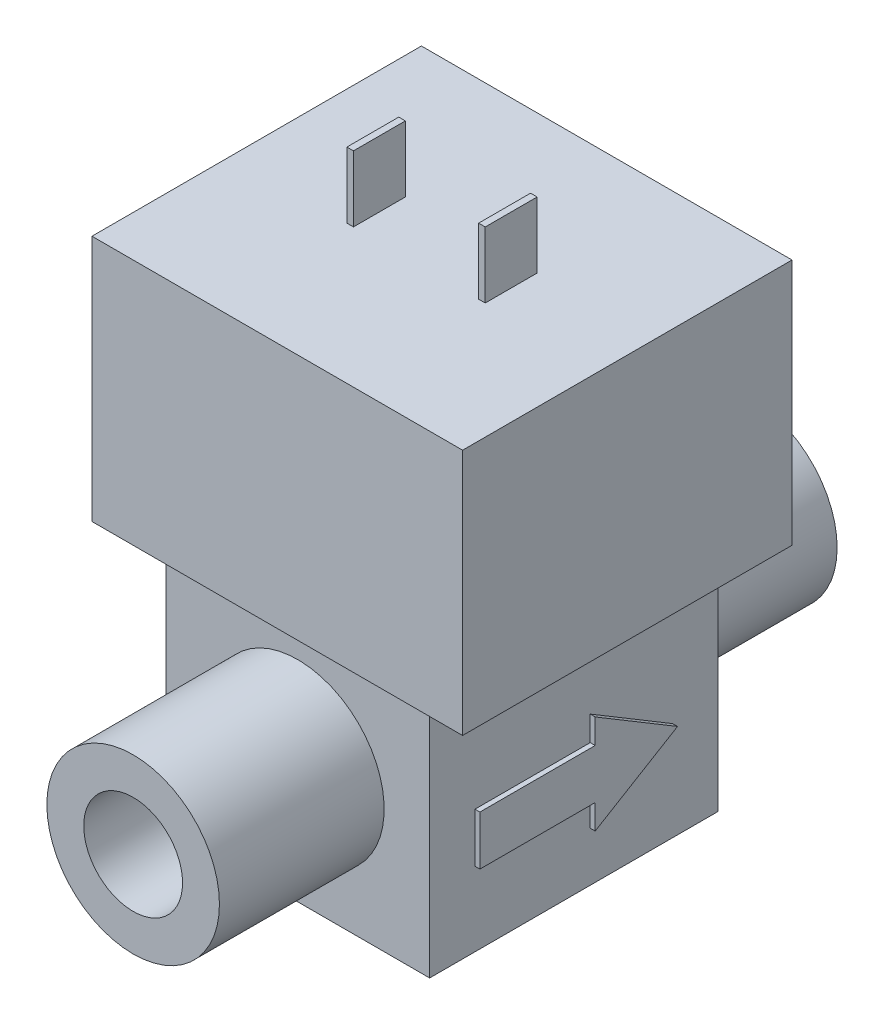
ISO-10303-21;
HEADER;
FILE_DESCRIPTION(('STEP AP214'),'2;1');
FILE_NAME('part.step','',(''),(''),'','','');
FILE_SCHEMA(('AUTOMOTIVE_DESIGN { 1 0 10303 214 1 1 1 1 }'));
ENDSEC;
DATA;
#1=APPLICATION_CONTEXT('core data for automotive mechanical design processes');
#2=APPLICATION_PROTOCOL_DEFINITION('international standard','automotive_design',2000,#1);
#3=PRODUCT_CONTEXT('',#1,'mechanical');
#4=PRODUCT('Part','Part','',(#3));
#5=PRODUCT_RELATED_PRODUCT_CATEGORY('part','',(#4));
#6=PRODUCT_DEFINITION_FORMATION('','',#4);
#7=PRODUCT_DEFINITION_CONTEXT('part definition',#1,'design');
#8=PRODUCT_DEFINITION('design','',#6,#7);
#9=PRODUCT_DEFINITION_SHAPE('','',#8);
#10=(LENGTH_UNIT() NAMED_UNIT(*) SI_UNIT(.MILLI.,.METRE.));
#11=(NAMED_UNIT(*) PLANE_ANGLE_UNIT() SI_UNIT($,.RADIAN.));
#12=(NAMED_UNIT(*) SI_UNIT($,.STERADIAN.) SOLID_ANGLE_UNIT());
#13=UNCERTAINTY_MEASURE_WITH_UNIT(LENGTH_MEASURE(1.E-05),#10,'distance_accuracy_value','');
#14=(GEOMETRIC_REPRESENTATION_CONTEXT(3) GLOBAL_UNCERTAINTY_ASSIGNED_CONTEXT((#13)) GLOBAL_UNIT_ASSIGNED_CONTEXT((#10,
#11,#12)) REPRESENTATION_CONTEXT('',''));
#15=CARTESIAN_POINT('',(0.,0.,0.));
#16=DIRECTION('',(0.,0.,1.));
#17=DIRECTION('',(1.,0.,0.));
#18=AXIS2_PLACEMENT_3D('',#15,#16,#17);
#19=CARTESIAN_POINT('',(16.,30.,17.5));
#20=DIRECTION('',(-1.,0.,0.));
#21=DIRECTION('',(0.,0.,1.));
#22=AXIS2_PLACEMENT_3D('',#19,#20,#21);
#23=PLANE('',#22);
#24=DIRECTION('',(0.,0.,-1.));
#25=VECTOR('',#24,1.);
#26=CARTESIAN_POINT('',(16.,0.,17.5));
#27=LINE('',#26,#25);
#28=CARTESIAN_POINT('',(16.,0.,17.5));
#29=VERTEX_POINT('',#28);
#30=CARTESIAN_POINT('',(16.,0.,-17.5));
#31=VERTEX_POINT('',#30);
#32=EDGE_CURVE('E363',#29,#31,#27,.T.);
#33=ORIENTED_EDGE('',*,*,#32,.T.);
#34=DIRECTION('',(0.,-1.,0.));
#35=VECTOR('',#34,1.);
#36=CARTESIAN_POINT('',(16.,30.,-17.5));
#37=LINE('',#36,#35);
#38=CARTESIAN_POINT('',(16.,30.,-17.5));
#39=VERTEX_POINT('',#38);
#40=EDGE_CURVE('E366',#39,#31,#37,.T.);
#41=ORIENTED_EDGE('',*,*,#40,.F.);
#42=DIRECTION('',(0.,0.,-1.));
#43=VECTOR('',#42,1.);
#44=CARTESIAN_POINT('',(16.,30.,17.5));
#45=LINE('',#44,#43);
#46=CARTESIAN_POINT('',(16.,30.,17.5));
#47=VERTEX_POINT('',#46);
#48=EDGE_CURVE('E349',#47,#39,#45,.T.);
#49=ORIENTED_EDGE('',*,*,#48,.F.);
#50=DIRECTION('',(0.,-1.,0.));
#51=VECTOR('',#50,1.);
#52=CARTESIAN_POINT('',(16.,30.,17.5));
#53=LINE('',#52,#51);
#54=EDGE_CURVE('E367',#47,#29,#53,.T.);
#55=ORIENTED_EDGE('',*,*,#54,.T.);
#56=EDGE_LOOP('',(#33,#41,#49,#55));
#57=FACE_BOUND('',#56,.T.);
#58=DIRECTION('',(0.,-1.,0.));
#59=VECTOR('',#58,1.);
#60=CARTESIAN_POINT('',(16.,15.,12.));
#61=LINE('',#60,#59);
#62=CARTESIAN_POINT('',(16.,15.,12.));
#63=VERTEX_POINT('',#62);
#64=CARTESIAN_POINT('',(16.,9.,12.));
#65=VERTEX_POINT('',#64);
#66=EDGE_CURVE('E225',#63,#65,#61,.T.);
#67=ORIENTED_EDGE('',*,*,#66,.F.);
#68=DIRECTION('',(0.,0.,1.));
#69=VECTOR('',#68,1.);
#70=CARTESIAN_POINT('',(16.,15.,-2.));
#71=LINE('',#70,#69);
#72=CARTESIAN_POINT('',(16.,15.,-2.));
#73=VERTEX_POINT('',#72);
#74=EDGE_CURVE('E217',#73,#63,#71,.T.);
#75=ORIENTED_EDGE('',*,*,#74,.F.);
#76=DIRECTION('',(0.,-1.,0.));
#77=VECTOR('',#76,1.);
#78=CARTESIAN_POINT('',(16.,18.,-2.));
#79=LINE('',#78,#77);
#80=CARTESIAN_POINT('',(16.,18.,-2.));
#81=VERTEX_POINT('',#80);
#82=EDGE_CURVE('E894',#81,#73,#79,.T.);
#83=ORIENTED_EDGE('',*,*,#82,.F.);
#84=DIRECTION('',(0.,0.514495755427527,0.857492925712544));
#85=VECTOR('',#84,1.);
#86=CARTESIAN_POINT('',(16.,12.,-12.));
#87=LINE('',#86,#85);
#88=CARTESIAN_POINT('',(16.,12.,-12.));
#89=VERTEX_POINT('',#88);
#90=EDGE_CURVE('E917',#89,#81,#87,.T.);
#91=ORIENTED_EDGE('',*,*,#90,.F.);
#92=DIRECTION('',(0.,0.514495755427526,-0.857492925712544));
#93=VECTOR('',#92,1.);
#94=CARTESIAN_POINT('',(16.,6.,-2.));
#95=LINE('',#94,#93);
#96=CARTESIAN_POINT('',(16.,5.99999999999999,-2.));
#97=VERTEX_POINT('',#96);
#98=EDGE_CURVE('E911',#97,#89,#95,.T.);
#99=ORIENTED_EDGE('',*,*,#98,.F.);
#100=DIRECTION('',(0.,-1.,0.));
#101=VECTOR('',#100,1.);
#102=CARTESIAN_POINT('',(16.,9.,-2.));
#103=LINE('',#102,#101);
#104=CARTESIAN_POINT('',(16.,9.,-2.));
#105=VERTEX_POINT('',#104);
#106=EDGE_CURVE('E70',#105,#97,#103,.T.);
#107=ORIENTED_EDGE('',*,*,#106,.F.);
#108=DIRECTION('',(0.,0.,-1.));
#109=VECTOR('',#108,1.);
#110=CARTESIAN_POINT('',(16.,9.,12.));
#111=LINE('',#110,#109);
#112=EDGE_CURVE('E65',#65,#105,#111,.T.);
#113=ORIENTED_EDGE('',*,*,#112,.F.);
#114=EDGE_LOOP('',(#67,#75,#83,#91,#99,#107,#113));
#115=FACE_BOUND('',#114,.T.);
#116=ADVANCED_FACE('F50',(#57,#115),#23,.F.);
#117=CARTESIAN_POINT('',(0.,60.,0.));
#118=DIRECTION('',(0.,-1.,0.));
#119=DIRECTION('',(0.,0.,-1.));
#120=AXIS2_PLACEMENT_3D('',#117,#118,#119);
#121=PLANE('',#120);
#122=DIRECTION('',(0.,0.,1.));
#123=VECTOR('',#122,1.);
#124=CARTESIAN_POINT('',(7.6,60.,-3.15));
#125=LINE('',#124,#123);
#126=CARTESIAN_POINT('',(7.6,60.,-3.15));
#127=VERTEX_POINT('',#126);
#128=CARTESIAN_POINT('',(7.6,60.,3.15));
#129=VERTEX_POINT('',#128);
#130=EDGE_CURVE('E250',#127,#129,#125,.T.);
#131=ORIENTED_EDGE('',*,*,#130,.F.);
#132=DIRECTION('',(-1.,0.,0.));
#133=VECTOR('',#132,1.);
#134=CARTESIAN_POINT('',(8.4,60.,-3.15));
#135=LINE('',#134,#133);
#136=CARTESIAN_POINT('',(8.4,60.,-3.15));
#137=VERTEX_POINT('',#136);
#138=EDGE_CURVE('E277',#137,#127,#135,.T.);
#139=ORIENTED_EDGE('',*,*,#138,.F.);
#140=DIRECTION('',(0.,0.,-1.));
#141=VECTOR('',#140,1.);
#142=CARTESIAN_POINT('',(8.4,60.,3.15));
#143=LINE('',#142,#141);
#144=CARTESIAN_POINT('',(8.4,60.,3.15));
#145=VERTEX_POINT('',#144);
#146=EDGE_CURVE('E276',#145,#137,#143,.T.);
#147=ORIENTED_EDGE('',*,*,#146,.F.);
#148=DIRECTION('',(1.,0.,0.));
#149=VECTOR('',#148,1.);
#150=CARTESIAN_POINT('',(7.6,60.,3.15));
#151=LINE('',#150,#149);
#152=EDGE_CURVE('E281',#129,#145,#151,.T.);
#153=ORIENTED_EDGE('',*,*,#152,.F.);
#154=EDGE_LOOP('',(#131,#139,#147,#153));
#155=FACE_BOUND('',#154,.T.);
#156=DIRECTION('',(0.,0.,-1.));
#157=VECTOR('',#156,1.);
#158=CARTESIAN_POINT('',(22.5,60.,20.));
#159=LINE('',#158,#157);
#160=CARTESIAN_POINT('',(22.5,60.,20.));
#161=VERTEX_POINT('',#160);
#162=CARTESIAN_POINT('',(22.5,60.,-20.));
#163=VERTEX_POINT('',#162);
#164=EDGE_CURVE('E312',#161,#163,#159,.T.);
#165=ORIENTED_EDGE('',*,*,#164,.T.);
#166=DIRECTION('',(-1.,0.,0.));
#167=VECTOR('',#166,1.);
#168=CARTESIAN_POINT('',(-22.5,60.,-20.));
#169=LINE('',#168,#167);
#170=CARTESIAN_POINT('',(-22.5,60.,-20.));
#171=VERTEX_POINT('',#170);
#172=EDGE_CURVE('E317',#163,#171,#169,.T.);
#173=ORIENTED_EDGE('',*,*,#172,.T.);
#174=DIRECTION('',(0.,0.,1.));
#175=VECTOR('',#174,1.);
#176=CARTESIAN_POINT('',(-22.5,60.,20.));
#177=LINE('',#176,#175);
#178=CARTESIAN_POINT('',(-22.5,60.,20.));
#179=VERTEX_POINT('',#178);
#180=EDGE_CURVE('E316',#171,#179,#177,.T.);
#181=ORIENTED_EDGE('',*,*,#180,.T.);
#182=DIRECTION('',(1.,0.,0.));
#183=VECTOR('',#182,1.);
#184=CARTESIAN_POINT('',(-22.5,60.,20.));
#185=LINE('',#184,#183);
#186=EDGE_CURVE('E322',#179,#161,#185,.T.);
#187=ORIENTED_EDGE('',*,*,#186,.T.);
#188=EDGE_LOOP('',(#165,#173,#181,#187));
#189=FACE_BOUND('',#188,.T.);
#190=DIRECTION('',(0.,0.,1.));
#191=VECTOR('',#190,1.);
#192=CARTESIAN_POINT('',(-8.4,60.,-3.15));
#193=LINE('',#192,#191);
#194=CARTESIAN_POINT('',(-8.4,60.,-3.15));
#195=VERTEX_POINT('',#194);
#196=CARTESIAN_POINT('',(-8.4,60.,3.15));
#197=VERTEX_POINT('',#196);
#198=EDGE_CURVE('E243',#195,#197,#193,.T.);
#199=ORIENTED_EDGE('',*,*,#198,.F.);
#200=DIRECTION('',(-1.,0.,0.));
#201=VECTOR('',#200,1.);
#202=CARTESIAN_POINT('',(-7.6,60.,-3.15));
#203=LINE('',#202,#201);
#204=CARTESIAN_POINT('',(-7.6,60.,-3.15));
#205=VERTEX_POINT('',#204);
#206=EDGE_CURVE('E236',#205,#195,#203,.T.);
#207=ORIENTED_EDGE('',*,*,#206,.F.);
#208=DIRECTION('',(0.,0.,-1.));
#209=VECTOR('',#208,1.);
#210=CARTESIAN_POINT('',(-7.6,60.,3.15));
#211=LINE('',#210,#209);
#212=CARTESIAN_POINT('',(-7.6,60.,3.15));
#213=VERTEX_POINT('',#212);
#214=EDGE_CURVE('E249',#213,#205,#211,.T.);
#215=ORIENTED_EDGE('',*,*,#214,.F.);
#216=DIRECTION('',(1.,0.,0.));
#217=VECTOR('',#216,1.);
#218=CARTESIAN_POINT('',(-8.4,60.,3.15));
#219=LINE('',#218,#217);
#220=EDGE_CURVE('E246',#197,#213,#219,.T.);
#221=ORIENTED_EDGE('',*,*,#220,.F.);
#222=EDGE_LOOP('',(#199,#207,#215,#221));
#223=FACE_BOUND('',#222,.T.);
#224=ADVANCED_FACE('F419',(#155,#189,#223),#121,.F.);
#225=CARTESIAN_POINT('',(-16.,30.,-17.5));
#226=DIRECTION('',(1.,0.,0.));
#227=DIRECTION('',(0.,0.,-1.));
#228=AXIS2_PLACEMENT_3D('',#225,#226,#227);
#229=PLANE('',#228);
#230=DIRECTION('',(0.,0.,1.));
#231=VECTOR('',#230,1.);
#232=CARTESIAN_POINT('',(-16.,0.,-17.5));
#233=LINE('',#232,#231);
#234=CARTESIAN_POINT('',(-16.,0.,-17.5));
#235=VERTEX_POINT('',#234);
#236=CARTESIAN_POINT('',(-16.,0.,17.5));
#237=VERTEX_POINT('',#236);
#238=EDGE_CURVE('E345',#235,#237,#233,.T.);
#239=ORIENTED_EDGE('',*,*,#238,.T.);
#240=DIRECTION('',(0.,-1.,0.));
#241=VECTOR('',#240,1.);
#242=CARTESIAN_POINT('',(-16.,30.,17.5));
#243=LINE('',#242,#241);
#244=CARTESIAN_POINT('',(-16.,30.,17.5));
#245=VERTEX_POINT('',#244);
#246=EDGE_CURVE('E375',#245,#237,#243,.T.);
#247=ORIENTED_EDGE('',*,*,#246,.F.);
#248=DIRECTION('',(0.,0.,1.));
#249=VECTOR('',#248,1.);
#250=CARTESIAN_POINT('',(-16.,30.,-17.5));
#251=LINE('',#250,#249);
#252=CARTESIAN_POINT('',(-16.,30.,-17.5));
#253=VERTEX_POINT('',#252);
#254=EDGE_CURVE('E344',#253,#245,#251,.T.);
#255=ORIENTED_EDGE('',*,*,#254,.F.);
#256=DIRECTION('',(0.,-1.,0.));
#257=VECTOR('',#256,1.);
#258=CARTESIAN_POINT('',(-16.,30.,-17.5));
#259=LINE('',#258,#257);
#260=EDGE_CURVE('E358',#253,#235,#259,.T.);
#261=ORIENTED_EDGE('',*,*,#260,.T.);
#262=EDGE_LOOP('',(#239,#247,#255,#261));
#263=FACE_BOUND('',#262,.T.);
#264=ADVANCED_FACE('F47',(#263),#229,.F.);
#265=CARTESIAN_POINT('',(-16.,30.,17.5));
#266=DIRECTION('',(0.,0.,-1.));
#267=DIRECTION('',(-1.,0.,0.));
#268=AXIS2_PLACEMENT_3D('',#265,#266,#267);
#269=PLANE('',#268);
#270=CARTESIAN_POINT('',(0.,15.,17.5));
#271=DIRECTION('',(0.,0.,-1.));
#272=DIRECTION('',(-1.,0.,0.));
#273=AXIS2_PLACEMENT_3D('',#270,#271,#272);
#274=CIRCLE('',#273,10.4775);
#275=CARTESIAN_POINT('',(-10.4775,15.,17.5));
#276=VERTEX_POINT('',#275);
#277=EDGE_CURVE('E54',#276,#276,#274,.F.);
#278=ORIENTED_EDGE('',*,*,#277,.F.);
#279=EDGE_LOOP('',(#278));
#280=FACE_BOUND('',#279,.T.);
#281=DIRECTION('',(1.,0.,0.));
#282=VECTOR('',#281,1.);
#283=CARTESIAN_POINT('',(-16.,0.,17.5));
#284=LINE('',#283,#282);
#285=EDGE_CURVE('E360',#237,#29,#284,.T.);
#286=ORIENTED_EDGE('',*,*,#285,.T.);
#287=ORIENTED_EDGE('',*,*,#54,.F.);
#288=DIRECTION('',(1.,0.,0.));
#289=VECTOR('',#288,1.);
#290=CARTESIAN_POINT('',(-16.,30.,17.5));
#291=LINE('',#290,#289);
#292=EDGE_CURVE('E348',#245,#47,#291,.T.);
#293=ORIENTED_EDGE('',*,*,#292,.F.);
#294=ORIENTED_EDGE('',*,*,#246,.T.);
#295=EDGE_LOOP('',(#286,#287,#293,#294));
#296=FACE_BOUND('',#295,.T.);
#297=ADVANCED_FACE('F378',(#280,#296),#269,.F.);
#298=CARTESIAN_POINT('',(16.,30.,-17.5));
#299=DIRECTION('',(0.,0.,1.));
#300=DIRECTION('',(1.,0.,0.));
#301=AXIS2_PLACEMENT_3D('',#298,#299,#300);
#302=PLANE('',#301);
#303=CARTESIAN_POINT('',(0.,15.,-17.5));
#304=DIRECTION('',(0.,0.,1.));
#305=DIRECTION('',(1.,0.,0.));
#306=AXIS2_PLACEMENT_3D('',#303,#304,#305);
#307=CIRCLE('',#306,10.4775);
#308=CARTESIAN_POINT('',(10.4775,15.,-17.5));
#309=VERTEX_POINT('',#308);
#310=EDGE_CURVE('E11',#309,#309,#307,.F.);
#311=ORIENTED_EDGE('',*,*,#310,.F.);
#312=EDGE_LOOP('',(#311));
#313=FACE_BOUND('',#312,.T.);
#314=DIRECTION('',(-1.,0.,0.));
#315=VECTOR('',#314,1.);
#316=CARTESIAN_POINT('',(16.,0.,-17.5));
#317=LINE('',#316,#315);
#318=EDGE_CURVE('E350',#31,#235,#317,.T.);
#319=ORIENTED_EDGE('',*,*,#318,.T.);
#320=ORIENTED_EDGE('',*,*,#260,.F.);
#321=DIRECTION('',(-1.,0.,0.));
#322=VECTOR('',#321,1.);
#323=CARTESIAN_POINT('',(16.,30.,-17.5));
#324=LINE('',#323,#322);
#325=EDGE_CURVE('E353',#39,#253,#324,.T.);
#326=ORIENTED_EDGE('',*,*,#325,.F.);
#327=ORIENTED_EDGE('',*,*,#40,.T.);
#328=EDGE_LOOP('',(#319,#320,#326,#327));
#329=FACE_BOUND('',#328,.T.);
#330=ADVANCED_FACE('F385',(#313,#329),#302,.F.);
#331=CARTESIAN_POINT('',(0.,0.,0.));
#332=DIRECTION('',(0.,1.,0.));
#333=DIRECTION('',(0.,0.,1.));
#334=AXIS2_PLACEMENT_3D('',#331,#332,#333);
#335=PLANE('',#334);
#336=ORIENTED_EDGE('',*,*,#238,.F.);
#337=ORIENTED_EDGE('',*,*,#318,.F.);
#338=ORIENTED_EDGE('',*,*,#32,.F.);
#339=ORIENTED_EDGE('',*,*,#285,.F.);
#340=EDGE_LOOP('',(#336,#337,#338,#339));
#341=FACE_BOUND('',#340,.T.);
#342=ADVANCED_FACE('F388',(#341),#335,.F.);
#343=CARTESIAN_POINT('',(22.5,60.,20.));
#344=DIRECTION('',(-1.,0.,0.));
#345=DIRECTION('',(0.,0.,1.));
#346=AXIS2_PLACEMENT_3D('',#343,#344,#345);
#347=PLANE('',#346);
#348=DIRECTION('',(0.,0.,-1.));
#349=VECTOR('',#348,1.);
#350=CARTESIAN_POINT('',(22.5,30.,20.));
#351=LINE('',#350,#349);
#352=CARTESIAN_POINT('',(22.5,30.,20.));
#353=VERTEX_POINT('',#352);
#354=CARTESIAN_POINT('',(22.5,30.,-20.));
#355=VERTEX_POINT('',#354);
#356=EDGE_CURVE('E315',#353,#355,#351,.T.);
#357=ORIENTED_EDGE('',*,*,#356,.T.);
#358=DIRECTION('',(0.,-1.,0.));
#359=VECTOR('',#358,1.);
#360=CARTESIAN_POINT('',(22.5,60.,-20.));
#361=LINE('',#360,#359);
#362=EDGE_CURVE('E339',#163,#355,#361,.T.);
#363=ORIENTED_EDGE('',*,*,#362,.F.);
#364=ORIENTED_EDGE('',*,*,#164,.F.);
#365=DIRECTION('',(0.,-1.,0.));
#366=VECTOR('',#365,1.);
#367=CARTESIAN_POINT('',(22.5,60.,20.));
#368=LINE('',#367,#366);
#369=EDGE_CURVE('E324',#161,#353,#368,.T.);
#370=ORIENTED_EDGE('',*,*,#369,.T.);
#371=EDGE_LOOP('',(#357,#363,#364,#370));
#372=FACE_BOUND('',#371,.T.);
#373=ADVANCED_FACE('F407',(#372),#347,.F.);
#374=CARTESIAN_POINT('',(-22.5,60.,-20.));
#375=DIRECTION('',(0.,0.,1.));
#376=DIRECTION('',(1.,0.,0.));
#377=AXIS2_PLACEMENT_3D('',#374,#375,#376);
#378=PLANE('',#377);
#379=DIRECTION('',(-1.,0.,0.));
#380=VECTOR('',#379,1.);
#381=CARTESIAN_POINT('',(-22.5,30.,-20.));
#382=LINE('',#381,#380);
#383=CARTESIAN_POINT('',(-22.5,30.,-20.));
#384=VERTEX_POINT('',#383);
#385=EDGE_CURVE('E328',#355,#384,#382,.T.);
#386=ORIENTED_EDGE('',*,*,#385,.T.);
#387=DIRECTION('',(0.,-1.,0.));
#388=VECTOR('',#387,1.);
#389=CARTESIAN_POINT('',(-22.5,60.,-20.));
#390=LINE('',#389,#388);
#391=EDGE_CURVE('E337',#171,#384,#390,.T.);
#392=ORIENTED_EDGE('',*,*,#391,.F.);
#393=ORIENTED_EDGE('',*,*,#172,.F.);
#394=ORIENTED_EDGE('',*,*,#362,.T.);
#395=EDGE_LOOP('',(#386,#392,#393,#394));
#396=FACE_BOUND('',#395,.T.);
#397=ADVANCED_FACE('F420',(#396),#378,.F.);
#398=CARTESIAN_POINT('',(-22.5,60.,20.));
#399=DIRECTION('',(1.,0.,0.));
#400=DIRECTION('',(0.,0.,-1.));
#401=AXIS2_PLACEMENT_3D('',#398,#399,#400);
#402=PLANE('',#401);
#403=DIRECTION('',(0.,0.,1.));
#404=VECTOR('',#403,1.);
#405=CARTESIAN_POINT('',(-22.5,30.,20.));
#406=LINE('',#405,#404);
#407=CARTESIAN_POINT('',(-22.5,30.,20.));
#408=VERTEX_POINT('',#407);
#409=EDGE_CURVE('E326',#384,#408,#406,.T.);
#410=ORIENTED_EDGE('',*,*,#409,.T.);
#411=DIRECTION('',(0.,-1.,0.));
#412=VECTOR('',#411,1.);
#413=CARTESIAN_POINT('',(-22.5,60.,20.));
#414=LINE('',#413,#412);
#415=EDGE_CURVE('E333',#179,#408,#414,.T.);
#416=ORIENTED_EDGE('',*,*,#415,.F.);
#417=ORIENTED_EDGE('',*,*,#180,.F.);
#418=ORIENTED_EDGE('',*,*,#391,.T.);
#419=EDGE_LOOP('',(#410,#416,#417,#418));
#420=FACE_BOUND('',#419,.T.);
#421=ADVANCED_FACE('F412',(#420),#402,.F.);
#422=CARTESIAN_POINT('',(-22.5,60.,20.));
#423=DIRECTION('',(0.,0.,-1.));
#424=DIRECTION('',(-1.,0.,0.));
#425=AXIS2_PLACEMENT_3D('',#422,#423,#424);
#426=PLANE('',#425);
#427=DIRECTION('',(1.,0.,0.));
#428=VECTOR('',#427,1.);
#429=CARTESIAN_POINT('',(-22.5,30.,20.));
#430=LINE('',#429,#428);
#431=EDGE_CURVE('E320',#408,#353,#430,.T.);
#432=ORIENTED_EDGE('',*,*,#431,.T.);
#433=ORIENTED_EDGE('',*,*,#369,.F.);
#434=ORIENTED_EDGE('',*,*,#186,.F.);
#435=ORIENTED_EDGE('',*,*,#415,.T.);
#436=EDGE_LOOP('',(#432,#433,#434,#435));
#437=FACE_BOUND('',#436,.T.);
#438=ADVANCED_FACE('F399',(#437),#426,.F.);
#439=CARTESIAN_POINT('',(0.,30.,0.));
#440=DIRECTION('',(0.,-1.,0.));
#441=DIRECTION('',(0.,0.,-1.));
#442=AXIS2_PLACEMENT_3D('',#439,#440,#441);
#443=PLANE('',#442);
#444=ORIENTED_EDGE('',*,*,#325,.T.);
#445=ORIENTED_EDGE('',*,*,#254,.T.);
#446=ORIENTED_EDGE('',*,*,#292,.T.);
#447=ORIENTED_EDGE('',*,*,#48,.T.);
#448=EDGE_LOOP('',(#444,#445,#446,#447));
#449=FACE_BOUND('',#448,.T.);
#450=ORIENTED_EDGE('',*,*,#356,.F.);
#451=ORIENTED_EDGE('',*,*,#431,.F.);
#452=ORIENTED_EDGE('',*,*,#409,.F.);
#453=ORIENTED_EDGE('',*,*,#385,.F.);
#454=EDGE_LOOP('',(#450,#451,#452,#453));
#455=FACE_BOUND('',#454,.T.);
#456=ADVANCED_FACE('F397',(#449,#455),#443,.T.);
#457=CARTESIAN_POINT('',(0.,15.,37.5));
#458=DIRECTION('',(0.,0.,-1.));
#459=DIRECTION('',(-1.,0.,0.));
#460=AXIS2_PLACEMENT_3D('',#457,#458,#459);
#461=CYLINDRICAL_SURFACE('',#460,10.4775);
#462=CARTESIAN_POINT('',(0.,15.,37.5));
#463=DIRECTION('',(0.,0.,1.));
#464=DIRECTION('',(1.,0.,0.));
#465=AXIS2_PLACEMENT_3D('',#462,#463,#464);
#466=CIRCLE('',#465,10.4775);
#467=CARTESIAN_POINT('',(10.4775,15.,37.5));
#468=VERTEX_POINT('',#467);
#469=EDGE_CURVE('E307',#468,#468,#466,.T.);
#470=ORIENTED_EDGE('',*,*,#469,.F.);
#471=EDGE_LOOP('',(#470));
#472=FACE_BOUND('',#471,.T.);
#473=ORIENTED_EDGE('',*,*,#277,.T.);
#474=EDGE_LOOP('',(#473));
#475=FACE_BOUND('',#474,.T.);
#476=ADVANCED_FACE('F380',(#472,#475),#461,.T.);
#477=CARTESIAN_POINT('',(0.,15.,37.5));
#478=DIRECTION('',(0.,0.,1.));
#479=DIRECTION('',(1.,0.,0.));
#480=AXIS2_PLACEMENT_3D('',#477,#478,#479);
#481=PLANE('',#480);
#482=CARTESIAN_POINT('',(0.,15.,37.5));
#483=DIRECTION('',(0.,0.,1.));
#484=DIRECTION('',(1.,0.,0.));
#485=AXIS2_PLACEMENT_3D('',#482,#483,#484);
#486=CIRCLE('',#485,6.);
#487=CARTESIAN_POINT('',(6.,15.,37.5));
#488=VERTEX_POINT('',#487);
#489=EDGE_CURVE('E296',#488,#488,#486,.T.);
#490=ORIENTED_EDGE('',*,*,#489,.F.);
#491=EDGE_LOOP('',(#490));
#492=FACE_BOUND('',#491,.T.);
#493=ORIENTED_EDGE('',*,*,#469,.T.);
#494=EDGE_LOOP('',(#493));
#495=FACE_BOUND('',#494,.T.);
#496=ADVANCED_FACE('F468',(#492,#495),#481,.T.);
#497=CARTESIAN_POINT('',(0.,15.,-17.5));
#498=DIRECTION('',(0.,0.,-1.));
#499=DIRECTION('',(-1.,0.,0.));
#500=AXIS2_PLACEMENT_3D('',#497,#498,#499);
#501=CYLINDRICAL_SURFACE('',#500,10.4775);
#502=ORIENTED_EDGE('',*,*,#310,.T.);
#503=EDGE_LOOP('',(#502));
#504=FACE_BOUND('',#503,.T.);
#505=CARTESIAN_POINT('',(0.,15.,-37.5));
#506=DIRECTION('',(0.,0.,1.));
#507=DIRECTION('',(1.,0.,0.));
#508=AXIS2_PLACEMENT_3D('',#505,#506,#507);
#509=CIRCLE('',#508,10.4775);
#510=CARTESIAN_POINT('',(10.4775,15.,-37.5));
#511=VERTEX_POINT('',#510);
#512=EDGE_CURVE('E302',#511,#511,#509,.T.);
#513=ORIENTED_EDGE('',*,*,#512,.T.);
#514=EDGE_LOOP('',(#513));
#515=FACE_BOUND('',#514,.T.);
#516=ADVANCED_FACE('F471',(#504,#515),#501,.T.);
#517=CARTESIAN_POINT('',(0.,15.,-37.5));
#518=DIRECTION('',(0.,0.,1.));
#519=DIRECTION('',(1.,0.,0.));
#520=AXIS2_PLACEMENT_3D('',#517,#518,#519);
#521=PLANE('',#520);
#522=CARTESIAN_POINT('',(0.,15.,-37.5));
#523=DIRECTION('',(0.,0.,1.));
#524=DIRECTION('',(1.,0.,0.));
#525=AXIS2_PLACEMENT_3D('',#522,#523,#524);
#526=CIRCLE('',#525,6.);
#527=CARTESIAN_POINT('',(6.,15.,-37.5));
#528=VERTEX_POINT('',#527);
#529=EDGE_CURVE('E264',#528,#528,#526,.T.);
#530=ORIENTED_EDGE('',*,*,#529,.T.);
#531=EDGE_LOOP('',(#530));
#532=FACE_BOUND('',#531,.T.);
#533=ORIENTED_EDGE('',*,*,#512,.F.);
#534=EDGE_LOOP('',(#533));
#535=FACE_BOUND('',#534,.T.);
#536=ADVANCED_FACE('F476',(#532,#535),#521,.F.);
#537=CARTESIAN_POINT('',(0.,15.,25.5));
#538=DIRECTION('',(0.,0.,1.));
#539=DIRECTION('',(1.,0.,0.));
#540=AXIS2_PLACEMENT_3D('',#537,#538,#539);
#541=CYLINDRICAL_SURFACE('',#540,6.);
#542=CARTESIAN_POINT('',(0.,15.,25.5));
#543=DIRECTION('',(0.,0.,1.));
#544=DIRECTION('',(1.,0.,0.));
#545=AXIS2_PLACEMENT_3D('',#542,#543,#544);
#546=CIRCLE('',#545,6.);
#547=CARTESIAN_POINT('',(6.,15.,25.5));
#548=VERTEX_POINT('',#547);
#549=EDGE_CURVE('E301',#548,#548,#546,.T.);
#550=ORIENTED_EDGE('',*,*,#549,.F.);
#551=EDGE_LOOP('',(#550));
#552=FACE_BOUND('',#551,.T.);
#553=ORIENTED_EDGE('',*,*,#489,.T.);
#554=EDGE_LOOP('',(#553));
#555=FACE_BOUND('',#554,.T.);
#556=ADVANCED_FACE('F485',(#552,#555),#541,.F.);
#557=CARTESIAN_POINT('',(0.,15.,25.5));
#558=DIRECTION('',(0.,0.,1.));
#559=DIRECTION('',(1.,0.,0.));
#560=AXIS2_PLACEMENT_3D('',#557,#558,#559);
#561=PLANE('',#560);
#562=ORIENTED_EDGE('',*,*,#549,.T.);
#563=EDGE_LOOP('',(#562));
#564=FACE_BOUND('',#563,.T.);
#565=ADVANCED_FACE('F488',(#564),#561,.T.);
#566=CARTESIAN_POINT('',(0.,15.,-25.5));
#567=DIRECTION('',(0.,0.,-1.));
#568=DIRECTION('',(-1.,0.,0.));
#569=AXIS2_PLACEMENT_3D('',#566,#567,#568);
#570=CYLINDRICAL_SURFACE('',#569,6.);
#571=CARTESIAN_POINT('',(0.,15.,-25.5));
#572=DIRECTION('',(0.,0.,1.));
#573=DIRECTION('',(1.,0.,0.));
#574=AXIS2_PLACEMENT_3D('',#571,#572,#573);
#575=CIRCLE('',#574,6.);
#576=CARTESIAN_POINT('',(6.,15.,-25.5));
#577=VERTEX_POINT('',#576);
#578=EDGE_CURVE('E294',#577,#577,#575,.T.);
#579=ORIENTED_EDGE('',*,*,#578,.T.);
#580=EDGE_LOOP('',(#579));
#581=FACE_BOUND('',#580,.T.);
#582=ORIENTED_EDGE('',*,*,#529,.F.);
#583=EDGE_LOOP('',(#582));
#584=FACE_BOUND('',#583,.T.);
#585=ADVANCED_FACE('F489',(#581,#584),#570,.F.);
#586=CARTESIAN_POINT('',(0.,15.,-25.5));
#587=DIRECTION('',(0.,0.,1.));
#588=DIRECTION('',(1.,0.,0.));
#589=AXIS2_PLACEMENT_3D('',#586,#587,#588);
#590=PLANE('',#589);
#591=ORIENTED_EDGE('',*,*,#578,.F.);
#592=EDGE_LOOP('',(#591));
#593=FACE_BOUND('',#592,.T.);
#594=ADVANCED_FACE('F494',(#593),#590,.F.);
#595=CARTESIAN_POINT('',(7.6,68.,-3.15));
#596=DIRECTION('',(1.,0.,0.));
#597=DIRECTION('',(0.,0.,-1.));
#598=AXIS2_PLACEMENT_3D('',#595,#596,#597);
#599=PLANE('',#598);
#600=ORIENTED_EDGE('',*,*,#130,.T.);
#601=DIRECTION('',(0.,-1.,0.));
#602=VECTOR('',#601,1.);
#603=CARTESIAN_POINT('',(7.6,68.,3.15));
#604=LINE('',#603,#602);
#605=CARTESIAN_POINT('',(7.6,68.,3.15));
#606=VERTEX_POINT('',#605);
#607=EDGE_CURVE('E223',#606,#129,#604,.T.);
#608=ORIENTED_EDGE('',*,*,#607,.F.);
#609=DIRECTION('',(0.,0.,1.));
#610=VECTOR('',#609,1.);
#611=CARTESIAN_POINT('',(7.6,68.,-3.15));
#612=LINE('',#611,#610);
#613=CARTESIAN_POINT('',(7.6,68.,-3.15));
#614=VERTEX_POINT('',#613);
#615=EDGE_CURVE('E278',#614,#606,#612,.T.);
#616=ORIENTED_EDGE('',*,*,#615,.F.);
#617=DIRECTION('',(0.,-1.,0.));
#618=VECTOR('',#617,1.);
#619=CARTESIAN_POINT('',(7.6,68.,-3.15));
#620=LINE('',#619,#618);
#621=EDGE_CURVE('E275',#614,#127,#620,.T.);
#622=ORIENTED_EDGE('',*,*,#621,.T.);
#623=EDGE_LOOP('',(#600,#608,#616,#622));
#624=FACE_BOUND('',#623,.T.);
#625=ADVANCED_FACE('F498',(#624),#599,.F.);
#626=CARTESIAN_POINT('',(7.6,68.,3.15));
#627=DIRECTION('',(0.,0.,-1.));
#628=DIRECTION('',(-1.,0.,0.));
#629=AXIS2_PLACEMENT_3D('',#626,#627,#628);
#630=PLANE('',#629);
#631=ORIENTED_EDGE('',*,*,#152,.T.);
#632=DIRECTION('',(0.,-1.,0.));
#633=VECTOR('',#632,1.);
#634=CARTESIAN_POINT('',(8.4,68.,3.15));
#635=LINE('',#634,#633);
#636=CARTESIAN_POINT('',(8.4,68.,3.15));
#637=VERTEX_POINT('',#636);
#638=EDGE_CURVE('E228',#637,#145,#635,.T.);
#639=ORIENTED_EDGE('',*,*,#638,.F.);
#640=DIRECTION('',(1.,0.,0.));
#641=VECTOR('',#640,1.);
#642=CARTESIAN_POINT('',(7.6,68.,3.15));
#643=LINE('',#642,#641);
#644=EDGE_CURVE('E293',#606,#637,#643,.T.);
#645=ORIENTED_EDGE('',*,*,#644,.F.);
#646=ORIENTED_EDGE('',*,*,#607,.T.);
#647=EDGE_LOOP('',(#631,#639,#645,#646));
#648=FACE_BOUND('',#647,.T.);
#649=ADVANCED_FACE('F509',(#648),#630,.F.);
#650=CARTESIAN_POINT('',(8.4,68.,3.15));
#651=DIRECTION('',(-1.,0.,0.));
#652=DIRECTION('',(0.,0.,1.));
#653=AXIS2_PLACEMENT_3D('',#650,#651,#652);
#654=PLANE('',#653);
#655=ORIENTED_EDGE('',*,*,#146,.T.);
#656=DIRECTION('',(0.,-1.,0.));
#657=VECTOR('',#656,1.);
#658=CARTESIAN_POINT('',(8.4,68.,-3.15));
#659=LINE('',#658,#657);
#660=CARTESIAN_POINT('',(8.4,68.,-3.15));
#661=VERTEX_POINT('',#660);
#662=EDGE_CURVE('E269',#661,#137,#659,.T.);
#663=ORIENTED_EDGE('',*,*,#662,.F.);
#664=DIRECTION('',(0.,0.,-1.));
#665=VECTOR('',#664,1.);
#666=CARTESIAN_POINT('',(8.4,68.,3.15));
#667=LINE('',#666,#665);
#668=EDGE_CURVE('E289',#637,#661,#667,.T.);
#669=ORIENTED_EDGE('',*,*,#668,.F.);
#670=ORIENTED_EDGE('',*,*,#638,.T.);
#671=EDGE_LOOP('',(#655,#663,#669,#670));
#672=FACE_BOUND('',#671,.T.);
#673=ADVANCED_FACE('F506',(#672),#654,.F.);
#674=CARTESIAN_POINT('',(8.4,68.,-3.15));
#675=DIRECTION('',(0.,0.,1.));
#676=DIRECTION('',(1.,0.,0.));
#677=AXIS2_PLACEMENT_3D('',#674,#675,#676);
#678=PLANE('',#677);
#679=ORIENTED_EDGE('',*,*,#138,.T.);
#680=ORIENTED_EDGE('',*,*,#621,.F.);
#681=DIRECTION('',(-1.,0.,0.));
#682=VECTOR('',#681,1.);
#683=CARTESIAN_POINT('',(8.4,68.,-3.15));
#684=LINE('',#683,#682);
#685=EDGE_CURVE('E273',#661,#614,#684,.T.);
#686=ORIENTED_EDGE('',*,*,#685,.F.);
#687=ORIENTED_EDGE('',*,*,#662,.T.);
#688=EDGE_LOOP('',(#679,#680,#686,#687));
#689=FACE_BOUND('',#688,.T.);
#690=ADVANCED_FACE('F505',(#689),#678,.F.);
#691=CARTESIAN_POINT('',(0.,68.,0.));
#692=DIRECTION('',(0.,1.,0.));
#693=DIRECTION('',(0.,0.,1.));
#694=AXIS2_PLACEMENT_3D('',#691,#692,#693);
#695=PLANE('',#694);
#696=ORIENTED_EDGE('',*,*,#615,.T.);
#697=ORIENTED_EDGE('',*,*,#644,.T.);
#698=ORIENTED_EDGE('',*,*,#668,.T.);
#699=ORIENTED_EDGE('',*,*,#685,.T.);
#700=EDGE_LOOP('',(#696,#697,#698,#699));
#701=FACE_BOUND('',#700,.T.);
#702=ADVANCED_FACE('F449',(#701),#695,.T.);
#703=CARTESIAN_POINT('',(-8.4,68.,-3.15));
#704=DIRECTION('',(1.,0.,0.));
#705=DIRECTION('',(0.,0.,-1.));
#706=AXIS2_PLACEMENT_3D('',#703,#704,#705);
#707=PLANE('',#706);
#708=ORIENTED_EDGE('',*,*,#198,.T.);
#709=DIRECTION('',(0.,-1.,0.));
#710=VECTOR('',#709,1.);
#711=CARTESIAN_POINT('',(-8.4,68.,3.15));
#712=LINE('',#711,#710);
#713=CARTESIAN_POINT('',(-8.4,68.,3.15));
#714=VERTEX_POINT('',#713);
#715=EDGE_CURVE('E261',#714,#197,#712,.T.);
#716=ORIENTED_EDGE('',*,*,#715,.F.);
#717=DIRECTION('',(0.,0.,1.));
#718=VECTOR('',#717,1.);
#719=CARTESIAN_POINT('',(-8.4,68.,-3.15));
#720=LINE('',#719,#718);
#721=CARTESIAN_POINT('',(-8.4,68.,-3.15));
#722=VERTEX_POINT('',#721);
#723=EDGE_CURVE('E235',#722,#714,#720,.T.);
#724=ORIENTED_EDGE('',*,*,#723,.F.);
#725=DIRECTION('',(0.,-1.,0.));
#726=VECTOR('',#725,1.);
#727=CARTESIAN_POINT('',(-8.4,68.,-3.15));
#728=LINE('',#727,#726);
#729=EDGE_CURVE('E245',#722,#195,#728,.T.);
#730=ORIENTED_EDGE('',*,*,#729,.T.);
#731=EDGE_LOOP('',(#708,#716,#724,#730));
#732=FACE_BOUND('',#731,.T.);
#733=ADVANCED_FACE('F435',(#732),#707,.F.);
#734=CARTESIAN_POINT('',(-8.4,68.,3.15));
#735=DIRECTION('',(0.,0.,-1.));
#736=DIRECTION('',(-1.,0.,0.));
#737=AXIS2_PLACEMENT_3D('',#734,#735,#736);
#738=PLANE('',#737);
#739=ORIENTED_EDGE('',*,*,#220,.T.);
#740=DIRECTION('',(0.,-1.,0.));
#741=VECTOR('',#740,1.);
#742=CARTESIAN_POINT('',(-7.6,68.,3.15));
#743=LINE('',#742,#741);
#744=CARTESIAN_POINT('',(-7.6,68.,3.15));
#745=VERTEX_POINT('',#744);
#746=EDGE_CURVE('E258',#745,#213,#743,.T.);
#747=ORIENTED_EDGE('',*,*,#746,.F.);
#748=DIRECTION('',(1.,0.,0.));
#749=VECTOR('',#748,1.);
#750=CARTESIAN_POINT('',(-8.4,68.,3.15));
#751=LINE('',#750,#749);
#752=EDGE_CURVE('E232',#714,#745,#751,.T.);
#753=ORIENTED_EDGE('',*,*,#752,.F.);
#754=ORIENTED_EDGE('',*,*,#715,.T.);
#755=EDGE_LOOP('',(#739,#747,#753,#754));
#756=FACE_BOUND('',#755,.T.);
#757=ADVANCED_FACE('F439',(#756),#738,.F.);
#758=CARTESIAN_POINT('',(-7.6,68.,3.15));
#759=DIRECTION('',(-1.,0.,0.));
#760=DIRECTION('',(0.,0.,1.));
#761=AXIS2_PLACEMENT_3D('',#758,#759,#760);
#762=PLANE('',#761);
#763=ORIENTED_EDGE('',*,*,#214,.T.);
#764=DIRECTION('',(0.,-1.,0.));
#765=VECTOR('',#764,1.);
#766=CARTESIAN_POINT('',(-7.6,68.,-3.15));
#767=LINE('',#766,#765);
#768=CARTESIAN_POINT('',(-7.6,68.,-3.15));
#769=VERTEX_POINT('',#768);
#770=EDGE_CURVE('E260',#769,#205,#767,.T.);
#771=ORIENTED_EDGE('',*,*,#770,.F.);
#772=DIRECTION('',(0.,0.,-1.));
#773=VECTOR('',#772,1.);
#774=CARTESIAN_POINT('',(-7.6,68.,3.15));
#775=LINE('',#774,#773);
#776=EDGE_CURVE('E238',#745,#769,#775,.T.);
#777=ORIENTED_EDGE('',*,*,#776,.F.);
#778=ORIENTED_EDGE('',*,*,#746,.T.);
#779=EDGE_LOOP('',(#763,#771,#777,#778));
#780=FACE_BOUND('',#779,.T.);
#781=ADVANCED_FACE('F438',(#780),#762,.F.);
#782=CARTESIAN_POINT('',(-7.6,68.,-3.15));
#783=DIRECTION('',(0.,0.,1.));
#784=DIRECTION('',(1.,0.,0.));
#785=AXIS2_PLACEMENT_3D('',#782,#783,#784);
#786=PLANE('',#785);
#787=ORIENTED_EDGE('',*,*,#206,.T.);
#788=ORIENTED_EDGE('',*,*,#729,.F.);
#789=DIRECTION('',(-1.,0.,0.));
#790=VECTOR('',#789,1.);
#791=CARTESIAN_POINT('',(-7.6,68.,-3.15));
#792=LINE('',#791,#790);
#793=EDGE_CURVE('E239',#769,#722,#792,.T.);
#794=ORIENTED_EDGE('',*,*,#793,.F.);
#795=ORIENTED_EDGE('',*,*,#770,.T.);
#796=EDGE_LOOP('',(#787,#788,#794,#795));
#797=FACE_BOUND('',#796,.T.);
#798=ADVANCED_FACE('F426',(#797),#786,.F.);
#799=CARTESIAN_POINT('',(0.,68.,0.));
#800=DIRECTION('',(0.,1.,0.));
#801=DIRECTION('',(0.,0.,1.));
#802=AXIS2_PLACEMENT_3D('',#799,#800,#801);
#803=PLANE('',#802);
#804=ORIENTED_EDGE('',*,*,#723,.T.);
#805=ORIENTED_EDGE('',*,*,#752,.T.);
#806=ORIENTED_EDGE('',*,*,#776,.T.);
#807=ORIENTED_EDGE('',*,*,#793,.T.);
#808=EDGE_LOOP('',(#804,#805,#806,#807));
#809=FACE_BOUND('',#808,.T.);
#810=ADVANCED_FACE('F432',(#809),#803,.T.);
#811=CARTESIAN_POINT('',(16.6,15.,12.));
#812=DIRECTION('',(0.,0.,-1.));
#813=DIRECTION('',(-1.,0.,0.));
#814=AXIS2_PLACEMENT_3D('',#811,#812,#813);
#815=PLANE('',#814);
#816=ORIENTED_EDGE('',*,*,#66,.T.);
#817=DIRECTION('',(-1.,0.,0.));
#818=VECTOR('',#817,1.);
#819=CARTESIAN_POINT('',(16.6,9.,12.));
#820=LINE('',#819,#818);
#821=CARTESIAN_POINT('',(16.6,9.,12.));
#822=VERTEX_POINT('',#821);
#823=EDGE_CURVE('E203',#822,#65,#820,.T.);
#824=ORIENTED_EDGE('',*,*,#823,.F.);
#825=DIRECTION('',(0.,-1.,0.));
#826=VECTOR('',#825,1.);
#827=CARTESIAN_POINT('',(16.6,15.,12.));
#828=LINE('',#827,#826);
#829=CARTESIAN_POINT('',(16.6,15.,12.));
#830=VERTEX_POINT('',#829);
#831=EDGE_CURVE('E208',#830,#822,#828,.T.);
#832=ORIENTED_EDGE('',*,*,#831,.F.);
#833=DIRECTION('',(-1.,0.,0.));
#834=VECTOR('',#833,1.);
#835=CARTESIAN_POINT('',(16.6,15.,12.));
#836=LINE('',#835,#834);
#837=EDGE_CURVE('E891',#830,#63,#836,.T.);
#838=ORIENTED_EDGE('',*,*,#837,.T.);
#839=EDGE_LOOP('',(#816,#824,#832,#838));
#840=FACE_BOUND('',#839,.T.);
#841=ADVANCED_FACE('F222',(#840),#815,.F.);
#842=CARTESIAN_POINT('',(16.6,9.,12.));
#843=DIRECTION('',(0.,1.,0.));
#844=DIRECTION('',(0.,0.,1.));
#845=AXIS2_PLACEMENT_3D('',#842,#843,#844);
#846=PLANE('',#845);
#847=ORIENTED_EDGE('',*,*,#112,.T.);
#848=DIRECTION('',(-1.,0.,0.));
#849=VECTOR('',#848,1.);
#850=CARTESIAN_POINT('',(16.6,9.,-2.));
#851=LINE('',#850,#849);
#852=CARTESIAN_POINT('',(16.6,9.,-2.));
#853=VERTEX_POINT('',#852);
#854=EDGE_CURVE('E207',#853,#105,#851,.T.);
#855=ORIENTED_EDGE('',*,*,#854,.F.);
#856=DIRECTION('',(0.,0.,-1.));
#857=VECTOR('',#856,1.);
#858=CARTESIAN_POINT('',(16.6,9.,12.));
#859=LINE('',#858,#857);
#860=EDGE_CURVE('E197',#822,#853,#859,.T.);
#861=ORIENTED_EDGE('',*,*,#860,.F.);
#862=ORIENTED_EDGE('',*,*,#823,.T.);
#863=EDGE_LOOP('',(#847,#855,#861,#862));
#864=FACE_BOUND('',#863,.T.);
#865=ADVANCED_FACE('F202',(#864),#846,.F.);
#866=CARTESIAN_POINT('',(16.6,9.,-2.));
#867=DIRECTION('',(0.,0.,-1.));
#868=DIRECTION('',(-1.,0.,0.));
#869=AXIS2_PLACEMENT_3D('',#866,#867,#868);
#870=PLANE('',#869);
#871=ORIENTED_EDGE('',*,*,#106,.T.);
#872=DIRECTION('',(-1.,0.,0.));
#873=VECTOR('',#872,1.);
#874=CARTESIAN_POINT('',(16.6,6.,-2.));
#875=LINE('',#874,#873);
#876=CARTESIAN_POINT('',(16.6,6.,-2.));
#877=VERTEX_POINT('',#876);
#878=EDGE_CURVE('E226',#877,#97,#875,.T.);
#879=ORIENTED_EDGE('',*,*,#878,.F.);
#880=DIRECTION('',(0.,-1.,0.));
#881=VECTOR('',#880,1.);
#882=CARTESIAN_POINT('',(16.6,9.,-2.));
#883=LINE('',#882,#881);
#884=EDGE_CURVE('E209',#853,#877,#883,.T.);
#885=ORIENTED_EDGE('',*,*,#884,.F.);
#886=ORIENTED_EDGE('',*,*,#854,.T.);
#887=EDGE_LOOP('',(#871,#879,#885,#886));
#888=FACE_BOUND('',#887,.T.);
#889=ADVANCED_FACE('F595',(#888),#870,.F.);
#890=CARTESIAN_POINT('',(16.6,6.,-2.));
#891=DIRECTION('',(0.,0.857492925712544,0.514495755427526));
#892=DIRECTION('',(0.,-0.514495755427527,0.857492925712544));
#893=AXIS2_PLACEMENT_3D('',#890,#891,#892);
#894=PLANE('',#893);
#895=ORIENTED_EDGE('',*,*,#98,.T.);
#896=DIRECTION('',(-1.,0.,0.));
#897=VECTOR('',#896,1.);
#898=CARTESIAN_POINT('',(16.6,12.,-12.));
#899=LINE('',#898,#897);
#900=CARTESIAN_POINT('',(16.6,12.,-12.));
#901=VERTEX_POINT('',#900);
#902=EDGE_CURVE('E907',#901,#89,#899,.T.);
#903=ORIENTED_EDGE('',*,*,#902,.F.);
#904=DIRECTION('',(0.,0.514495755427526,-0.857492925712544));
#905=VECTOR('',#904,1.);
#906=CARTESIAN_POINT('',(16.6,6.,-2.));
#907=LINE('',#906,#905);
#908=EDGE_CURVE('E912',#877,#901,#907,.T.);
#909=ORIENTED_EDGE('',*,*,#908,.F.);
#910=ORIENTED_EDGE('',*,*,#878,.T.);
#911=EDGE_LOOP('',(#895,#903,#909,#910));
#912=FACE_BOUND('',#911,.T.);
#913=ADVANCED_FACE('F602',(#912),#894,.F.);
#914=CARTESIAN_POINT('',(16.6,12.,-12.));
#915=DIRECTION('',(0.,-0.857492925712544,0.514495755427527));
#916=DIRECTION('',(0.,-0.514495755427527,-0.857492925712544));
#917=AXIS2_PLACEMENT_3D('',#914,#915,#916);
#918=PLANE('',#917);
#919=ORIENTED_EDGE('',*,*,#90,.T.);
#920=DIRECTION('',(-1.,0.,0.));
#921=VECTOR('',#920,1.);
#922=CARTESIAN_POINT('',(16.6,18.,-2.));
#923=LINE('',#922,#921);
#924=CARTESIAN_POINT('',(16.6,18.,-2.));
#925=VERTEX_POINT('',#924);
#926=EDGE_CURVE('E897',#925,#81,#923,.T.);
#927=ORIENTED_EDGE('',*,*,#926,.F.);
#928=DIRECTION('',(0.,0.514495755427527,0.857492925712544));
#929=VECTOR('',#928,1.);
#930=CARTESIAN_POINT('',(16.6,12.,-12.));
#931=LINE('',#930,#929);
#932=EDGE_CURVE('E923',#901,#925,#931,.T.);
#933=ORIENTED_EDGE('',*,*,#932,.F.);
#934=ORIENTED_EDGE('',*,*,#902,.T.);
#935=EDGE_LOOP('',(#919,#927,#933,#934));
#936=FACE_BOUND('',#935,.T.);
#937=ADVANCED_FACE('F612',(#936),#918,.F.);
#938=CARTESIAN_POINT('',(16.6,18.,-2.));
#939=DIRECTION('',(0.,0.,-1.));
#940=DIRECTION('',(-1.,0.,0.));
#941=AXIS2_PLACEMENT_3D('',#938,#939,#940);
#942=PLANE('',#941);
#943=ORIENTED_EDGE('',*,*,#82,.T.);
#944=DIRECTION('',(-1.,0.,0.));
#945=VECTOR('',#944,1.);
#946=CARTESIAN_POINT('',(16.6,15.,-2.));
#947=LINE('',#946,#945);
#948=CARTESIAN_POINT('',(16.6,15.,-2.));
#949=VERTEX_POINT('',#948);
#950=EDGE_CURVE('E893',#949,#73,#947,.T.);
#951=ORIENTED_EDGE('',*,*,#950,.F.);
#952=DIRECTION('',(0.,-1.,0.));
#953=VECTOR('',#952,1.);
#954=CARTESIAN_POINT('',(16.6,18.,-2.));
#955=LINE('',#954,#953);
#956=EDGE_CURVE('E899',#925,#949,#955,.T.);
#957=ORIENTED_EDGE('',*,*,#956,.F.);
#958=ORIENTED_EDGE('',*,*,#926,.T.);
#959=EDGE_LOOP('',(#943,#951,#957,#958));
#960=FACE_BOUND('',#959,.T.);
#961=ADVANCED_FACE('F623',(#960),#942,.F.);
#962=CARTESIAN_POINT('',(16.6,15.,-2.));
#963=DIRECTION('',(0.,-1.,0.));
#964=DIRECTION('',(0.,0.,-1.));
#965=AXIS2_PLACEMENT_3D('',#962,#963,#964);
#966=PLANE('',#965);
#967=ORIENTED_EDGE('',*,*,#74,.T.);
#968=ORIENTED_EDGE('',*,*,#837,.F.);
#969=DIRECTION('',(0.,0.,1.));
#970=VECTOR('',#969,1.);
#971=CARTESIAN_POINT('',(16.6,15.,-2.));
#972=LINE('',#971,#970);
#973=EDGE_CURVE('E213',#949,#830,#972,.T.);
#974=ORIENTED_EDGE('',*,*,#973,.F.);
#975=ORIENTED_EDGE('',*,*,#950,.T.);
#976=EDGE_LOOP('',(#967,#968,#974,#975));
#977=FACE_BOUND('',#976,.T.);
#978=ADVANCED_FACE('F631',(#977),#966,.F.);
#979=CARTESIAN_POINT('',(16.6,0.,0.));
#980=DIRECTION('',(1.,0.,0.));
#981=DIRECTION('',(0.,0.,-1.));
#982=AXIS2_PLACEMENT_3D('',#979,#980,#981);
#983=PLANE('',#982);
#984=ORIENTED_EDGE('',*,*,#831,.T.);
#985=ORIENTED_EDGE('',*,*,#860,.T.);
#986=ORIENTED_EDGE('',*,*,#884,.T.);
#987=ORIENTED_EDGE('',*,*,#908,.T.);
#988=ORIENTED_EDGE('',*,*,#932,.T.);
#989=ORIENTED_EDGE('',*,*,#956,.T.);
#990=ORIENTED_EDGE('',*,*,#973,.T.);
#991=EDGE_LOOP('',(#984,#985,#986,#987,#988,#989,#990));
#992=FACE_BOUND('',#991,.T.);
#993=ADVANCED_FACE('F214',(#992),#983,.T.);
#994=CLOSED_SHELL('',(#116,#224,#264,#297,#330,#342,#373,#397,#421,#438,#456,#476,#496,#516,
#536,#556,#565,#585,#594,#625,#649,#673,#690,#702,#733,#757,#781,#798,#810,#841,#865,#889,#913,
#937,#961,#978,#993));
#995=MANIFOLD_SOLID_BREP('B2',#994);
#996=ADVANCED_BREP_SHAPE_REPRESENTATION('',(#18,#995),#14);
#997=SHAPE_DEFINITION_REPRESENTATION(#9,#996);
ENDSEC;
END-ISO-10303-21;
